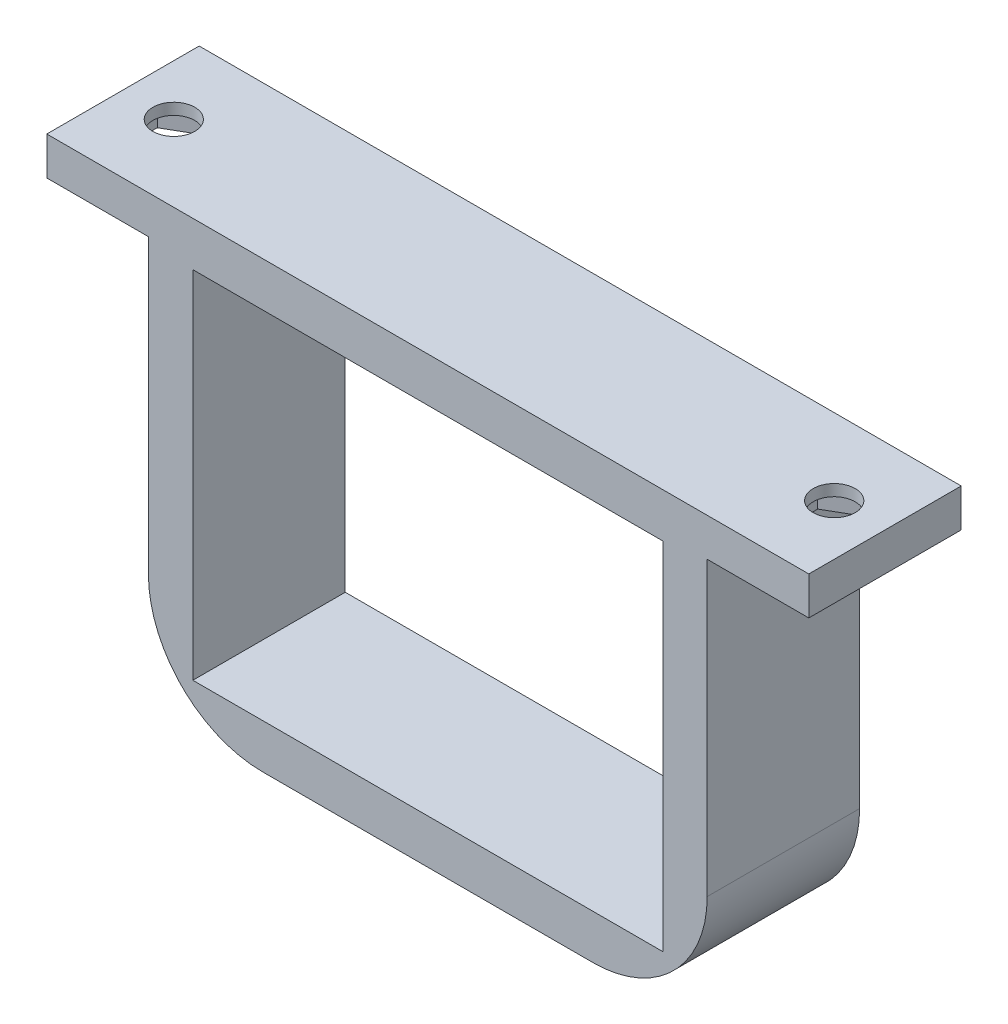
ISO-10303-21;
HEADER;
FILE_DESCRIPTION(('STEP AP214'),'2;1');
FILE_NAME('part.step','',(''),(''),'','','');
FILE_SCHEMA(('AUTOMOTIVE_DESIGN { 1 0 10303 214 1 1 1 1 }'));
ENDSEC;
DATA;
#1=APPLICATION_CONTEXT('core data for automotive mechanical design processes');
#2=APPLICATION_PROTOCOL_DEFINITION('international standard','automotive_design',2000,#1);
#3=PRODUCT_CONTEXT('',#1,'mechanical');
#4=PRODUCT('Part','Part','',(#3));
#5=PRODUCT_RELATED_PRODUCT_CATEGORY('part','',(#4));
#6=PRODUCT_DEFINITION_FORMATION('','',#4);
#7=PRODUCT_DEFINITION_CONTEXT('part definition',#1,'design');
#8=PRODUCT_DEFINITION('design','',#6,#7);
#9=PRODUCT_DEFINITION_SHAPE('','',#8);
#10=(LENGTH_UNIT() NAMED_UNIT(*) SI_UNIT(.MILLI.,.METRE.));
#11=(NAMED_UNIT(*) PLANE_ANGLE_UNIT() SI_UNIT($,.RADIAN.));
#12=(NAMED_UNIT(*) SI_UNIT($,.STERADIAN.) SOLID_ANGLE_UNIT());
#13=UNCERTAINTY_MEASURE_WITH_UNIT(LENGTH_MEASURE(1.E-05),#10,'distance_accuracy_value','');
#14=(GEOMETRIC_REPRESENTATION_CONTEXT(3) GLOBAL_UNCERTAINTY_ASSIGNED_CONTEXT((#13)) GLOBAL_UNIT_ASSIGNED_CONTEXT((#10,
#11,#12)) REPRESENTATION_CONTEXT('',''));
#15=CARTESIAN_POINT('',(0.,0.,0.));
#16=DIRECTION('',(0.,0.,1.));
#17=DIRECTION('',(1.,0.,0.));
#18=AXIS2_PLACEMENT_3D('',#15,#16,#17);
#19=CARTESIAN_POINT('',(0.,0.,7.8));
#20=DIRECTION('',(-1.,0.,0.));
#21=DIRECTION('',(0.,0.,1.));
#22=AXIS2_PLACEMENT_3D('',#19,#20,#21);
#23=PLANE('',#22);
#24=DIRECTION('',(0.,1.,0.));
#25=VECTOR('',#24,1.);
#26=CARTESIAN_POINT('',(0.,0.,10.));
#27=LINE('',#26,#25);
#28=CARTESIAN_POINT('',(0.,9.,10.));
#29=VERTEX_POINT('',#28);
#30=CARTESIAN_POINT('',(0.,32.,10.));
#31=VERTEX_POINT('',#30);
#32=EDGE_CURVE('E378',#29,#31,#27,.T.);
#33=ORIENTED_EDGE('',*,*,#32,.F.);
#34=DIRECTION('',(0.,0.,-1.));
#35=VECTOR('',#34,1.);
#36=CARTESIAN_POINT('',(0.,9.,-2.));
#37=LINE('',#36,#35);
#38=CARTESIAN_POINT('',(0.,9.,-2.));
#39=VERTEX_POINT('',#38);
#40=EDGE_CURVE('E461',#29,#39,#37,.T.);
#41=ORIENTED_EDGE('',*,*,#40,.T.);
#42=DIRECTION('',(0.,1.,0.));
#43=VECTOR('',#42,1.);
#44=CARTESIAN_POINT('',(0.,0.,-2.));
#45=LINE('',#44,#43);
#46=CARTESIAN_POINT('',(0.,32.,-2.));
#47=VERTEX_POINT('',#46);
#48=EDGE_CURVE('E424',#39,#47,#45,.T.);
#49=ORIENTED_EDGE('',*,*,#48,.T.);
#50=DIRECTION('',(0.,0.,-1.));
#51=VECTOR('',#50,1.);
#52=CARTESIAN_POINT('',(0.,32.,7.8));
#53=LINE('',#52,#51);
#54=EDGE_CURVE('E452',#31,#47,#53,.T.);
#55=ORIENTED_EDGE('',*,*,#54,.F.);
#56=EDGE_LOOP('',(#33,#41,#49,#55));
#57=FACE_BOUND('',#56,.T.);
#58=ADVANCED_FACE('F40',(#57),#23,.F.);
#59=CARTESIAN_POINT('',(0.,32.,7.8));
#60=DIRECTION('',(0.,-1.,0.));
#61=DIRECTION('',(0.,0.,-1.));
#62=AXIS2_PLACEMENT_3D('',#59,#60,#61);
#63=PLANE('',#62);
#64=DIRECTION('',(0.,0.,-1.));
#65=VECTOR('',#64,1.);
#66=CARTESIAN_POINT('',(0.925000000000016,32.,0.));
#67=LINE('',#66,#65);
#68=CARTESIAN_POINT('',(0.925000000000013,32.,5.7753520777581));
#69=VERTEX_POINT('',#68);
#70=CARTESIAN_POINT('',(0.925000000000015,32.,2.2246479222419));
#71=VERTEX_POINT('',#70);
#72=EDGE_CURVE('E58',#69,#71,#67,.T.);
#73=ORIENTED_EDGE('',*,*,#72,.F.);
#74=DIRECTION('',(-0.866025403784438,0.,-0.500000000000001));
#75=VECTOR('',#74,1.);
#76=CARTESIAN_POINT('',(-2.26955080756885,32.,3.93097730906827));
#77=LINE('',#76,#75);
#78=CARTESIAN_POINT('',(4.00000000000001,32.,7.5507041555162));
#79=VERTEX_POINT('',#78);
#80=EDGE_CURVE('E297',#79,#69,#77,.T.);
#81=ORIENTED_EDGE('',*,*,#80,.F.);
#82=DIRECTION('',(-0.866025403784439,0.,0.5));
#83=VECTOR('',#82,1.);
#84=CARTESIAN_POINT('',(4.2695508075689,32.,7.39507892420602));
#85=LINE('',#84,#83);
#86=CARTESIAN_POINT('',(7.07500000000001,32.,5.7753520777581));
#87=VERTEX_POINT('',#86);
#88=EDGE_CURVE('E333',#87,#79,#85,.T.);
#89=ORIENTED_EDGE('',*,*,#88,.F.);
#90=DIRECTION('',(0.,0.,1.));
#91=VECTOR('',#90,1.);
#92=CARTESIAN_POINT('',(7.07500000000002,32.,0.));
#93=LINE('',#92,#91);
#94=CARTESIAN_POINT('',(7.07500000000002,32.,2.2246479222419));
#95=VERTEX_POINT('',#94);
#96=EDGE_CURVE('E329',#95,#87,#93,.T.);
#97=ORIENTED_EDGE('',*,*,#96,.F.);
#98=DIRECTION('',(0.866025403784438,0.,0.500000000000001));
#99=VECTOR('',#98,1.);
#100=CARTESIAN_POINT('',(0.805449192431151,32.,-1.39507892420602));
#101=LINE('',#100,#99);
#102=CARTESIAN_POINT('',(4.00000000000002,32.,0.449295844483802));
#103=VERTEX_POINT('',#102);
#104=EDGE_CURVE('E325',#103,#95,#101,.T.);
#105=ORIENTED_EDGE('',*,*,#104,.F.);
#106=DIRECTION('',(0.866025403784439,0.,-0.499999999999999));
#107=VECTOR('',#106,1.);
#108=CARTESIAN_POINT('',(1.1945508075689,32.,2.06902269093172));
#109=LINE('',#108,#107);
#110=EDGE_CURVE('E320',#71,#103,#109,.T.);
#111=ORIENTED_EDGE('',*,*,#110,.F.);
#112=EDGE_LOOP('',(#73,#81,#89,#97,#105,#111));
#113=FACE_BOUND('',#112,.T.);
#114=ORIENTED_EDGE('',*,*,#54,.T.);
#115=DIRECTION('',(-1.,0.,0.));
#116=VECTOR('',#115,1.);
#117=CARTESIAN_POINT('',(0.,32.,-2.));
#118=LINE('',#117,#116);
#119=CARTESIAN_POINT('',(8.,32.,-2.));
#120=VERTEX_POINT('',#119);
#121=EDGE_CURVE('E427',#120,#47,#118,.T.);
#122=ORIENTED_EDGE('',*,*,#121,.F.);
#123=DIRECTION('',(0.,0.,-1.));
#124=VECTOR('',#123,1.);
#125=CARTESIAN_POINT('',(8.,32.,7.8));
#126=LINE('',#125,#124);
#127=CARTESIAN_POINT('',(8.,32.,10.));
#128=VERTEX_POINT('',#127);
#129=EDGE_CURVE('E474',#128,#120,#126,.T.);
#130=ORIENTED_EDGE('',*,*,#129,.F.);
#131=DIRECTION('',(-1.,0.,0.));
#132=VECTOR('',#131,1.);
#133=CARTESIAN_POINT('',(0.,32.,10.));
#134=LINE('',#133,#132);
#135=EDGE_CURVE('E381',#128,#31,#134,.T.);
#136=ORIENTED_EDGE('',*,*,#135,.T.);
#137=EDGE_LOOP('',(#114,#122,#130,#136));
#138=FACE_BOUND('',#137,.T.);
#139=ADVANCED_FACE('F530',(#113,#138),#63,.T.);
#140=CARTESIAN_POINT('',(8.,0.,7.8));
#141=DIRECTION('',(1.,0.,0.));
#142=DIRECTION('',(0.,0.,-1.));
#143=AXIS2_PLACEMENT_3D('',#140,#141,#142);
#144=PLANE('',#143);
#145=ORIENTED_EDGE('',*,*,#129,.T.);
#146=DIRECTION('',(0.,-1.,0.));
#147=VECTOR('',#146,1.);
#148=CARTESIAN_POINT('',(8.,0.,-2.));
#149=LINE('',#148,#147);
#150=CARTESIAN_POINT('',(8.,35.,-2.));
#151=VERTEX_POINT('',#150);
#152=EDGE_CURVE('E431',#151,#120,#149,.T.);
#153=ORIENTED_EDGE('',*,*,#152,.F.);
#154=DIRECTION('',(0.,0.,-1.));
#155=VECTOR('',#154,1.);
#156=CARTESIAN_POINT('',(8.,35.,7.8));
#157=LINE('',#156,#155);
#158=CARTESIAN_POINT('',(8.,35.,10.));
#159=VERTEX_POINT('',#158);
#160=EDGE_CURVE('E471',#159,#151,#157,.T.);
#161=ORIENTED_EDGE('',*,*,#160,.F.);
#162=DIRECTION('',(0.,-1.,0.));
#163=VECTOR('',#162,1.);
#164=CARTESIAN_POINT('',(8.,0.,10.));
#165=LINE('',#164,#163);
#166=EDGE_CURVE('E385',#159,#128,#165,.T.);
#167=ORIENTED_EDGE('',*,*,#166,.T.);
#168=EDGE_LOOP('',(#145,#153,#161,#167));
#169=FACE_BOUND('',#168,.T.);
#170=ADVANCED_FACE('F536',(#169),#144,.T.);
#171=CARTESIAN_POINT('',(0.,35.,7.8));
#172=DIRECTION('',(0.,-1.,0.));
#173=DIRECTION('',(0.,0.,-1.));
#174=AXIS2_PLACEMENT_3D('',#171,#172,#173);
#175=PLANE('',#174);
#176=CARTESIAN_POINT('',(-48.,35.,4.));
#177=DIRECTION('',(0.,-1.,0.));
#178=DIRECTION('',(0.,0.,-1.));
#179=AXIS2_PLACEMENT_3D('',#176,#177,#178);
#180=CIRCLE('',#179,1.65000000000001);
#181=CARTESIAN_POINT('',(-48.,35.,2.34999999999999));
#182=VERTEX_POINT('',#181);
#183=EDGE_CURVE('E511',#182,#182,#180,.T.);
#184=ORIENTED_EDGE('',*,*,#183,.T.);
#185=EDGE_LOOP('',(#184));
#186=FACE_BOUND('',#185,.T.);
#187=CARTESIAN_POINT('',(4.00000000000002,35.,4.));
#188=DIRECTION('',(0.,-1.,0.));
#189=DIRECTION('',(0.,0.,-1.));
#190=AXIS2_PLACEMENT_3D('',#187,#188,#189);
#191=CIRCLE('',#190,1.65000000000001);
#192=CARTESIAN_POINT('',(4.00000000000002,35.,2.34999999999999));
#193=VERTEX_POINT('',#192);
#194=EDGE_CURVE('E246',#193,#193,#191,.T.);
#195=ORIENTED_EDGE('',*,*,#194,.T.);
#196=EDGE_LOOP('',(#195));
#197=FACE_BOUND('',#196,.T.);
#198=ORIENTED_EDGE('',*,*,#160,.T.);
#199=DIRECTION('',(-1.,0.,0.));
#200=VECTOR('',#199,1.);
#201=CARTESIAN_POINT('',(0.,35.,-2.));
#202=LINE('',#201,#200);
#203=CARTESIAN_POINT('',(-52.,35.,-2.));
#204=VERTEX_POINT('',#203);
#205=EDGE_CURVE('E435',#151,#204,#202,.T.);
#206=ORIENTED_EDGE('',*,*,#205,.T.);
#207=DIRECTION('',(0.,0.,-1.));
#208=VECTOR('',#207,1.);
#209=CARTESIAN_POINT('',(-52.,35.,7.8));
#210=LINE('',#209,#208);
#211=CARTESIAN_POINT('',(-52.,35.,10.));
#212=VERTEX_POINT('',#211);
#213=EDGE_CURVE('E468',#212,#204,#210,.T.);
#214=ORIENTED_EDGE('',*,*,#213,.F.);
#215=DIRECTION('',(-1.,0.,0.));
#216=VECTOR('',#215,1.);
#217=CARTESIAN_POINT('',(0.,35.,10.));
#218=LINE('',#217,#216);
#219=EDGE_CURVE('E389',#159,#212,#218,.T.);
#220=ORIENTED_EDGE('',*,*,#219,.F.);
#221=EDGE_LOOP('',(#198,#206,#214,#220));
#222=FACE_BOUND('',#221,.T.);
#223=ADVANCED_FACE('F518',(#186,#197,#222),#175,.F.);
#224=CARTESIAN_POINT('',(-52.,0.,7.8));
#225=DIRECTION('',(1.,0.,0.));
#226=DIRECTION('',(0.,0.,-1.));
#227=AXIS2_PLACEMENT_3D('',#224,#225,#226);
#228=PLANE('',#227);
#229=ORIENTED_EDGE('',*,*,#213,.T.);
#230=DIRECTION('',(0.,-1.,0.));
#231=VECTOR('',#230,1.);
#232=CARTESIAN_POINT('',(-52.,0.,-2.));
#233=LINE('',#232,#231);
#234=CARTESIAN_POINT('',(-52.,32.,-2.));
#235=VERTEX_POINT('',#234);
#236=EDGE_CURVE('E439',#204,#235,#233,.T.);
#237=ORIENTED_EDGE('',*,*,#236,.T.);
#238=DIRECTION('',(0.,0.,-1.));
#239=VECTOR('',#238,1.);
#240=CARTESIAN_POINT('',(-52.,32.,7.8));
#241=LINE('',#240,#239);
#242=CARTESIAN_POINT('',(-52.,32.,10.));
#243=VERTEX_POINT('',#242);
#244=EDGE_CURVE('E465',#243,#235,#241,.T.);
#245=ORIENTED_EDGE('',*,*,#244,.F.);
#246=DIRECTION('',(0.,-1.,0.));
#247=VECTOR('',#246,1.);
#248=CARTESIAN_POINT('',(-52.,0.,10.));
#249=LINE('',#248,#247);
#250=EDGE_CURVE('E393',#212,#243,#249,.T.);
#251=ORIENTED_EDGE('',*,*,#250,.F.);
#252=EDGE_LOOP('',(#229,#237,#245,#251));
#253=FACE_BOUND('',#252,.T.);
#254=ADVANCED_FACE('F588',(#253),#228,.F.);
#255=CARTESIAN_POINT('',(0.,32.,7.8));
#256=DIRECTION('',(0.,1.,0.));
#257=DIRECTION('',(-1.,0.,0.));
#258=AXIS2_PLACEMENT_3D('',#255,#256,#257);
#259=PLANE('',#258);
#260=DIRECTION('',(0.,0.,1.));
#261=VECTOR('',#260,1.);
#262=CARTESIAN_POINT('',(-44.925,32.,0.));
#263=LINE('',#262,#261);
#264=CARTESIAN_POINT('',(-44.925,32.,2.22464792224189));
#265=VERTEX_POINT('',#264);
#266=CARTESIAN_POINT('',(-44.925,32.,5.77535207775809));
#267=VERTEX_POINT('',#266);
#268=EDGE_CURVE('E262',#265,#267,#263,.T.);
#269=ORIENTED_EDGE('',*,*,#268,.F.);
#270=DIRECTION('',(0.866025403784439,0.,0.5));
#271=VECTOR('',#270,1.);
#272=CARTESIAN_POINT('',(-12.1945508075688,32.,21.1215815741894));
#273=LINE('',#272,#271);
#274=CARTESIAN_POINT('',(-48.,32.,0.449295844483791));
#275=VERTEX_POINT('',#274);
#276=EDGE_CURVE('E66',#275,#265,#273,.T.);
#277=ORIENTED_EDGE('',*,*,#276,.F.);
#278=DIRECTION('',(0.866025403784439,0.,-0.5));
#279=VECTOR('',#278,1.);
#280=CARTESIAN_POINT('',(-11.8054491924311,32.,-20.4476378074637));
#281=LINE('',#280,#279);
#282=CARTESIAN_POINT('',(-51.075,32.,2.2246479222419));
#283=VERTEX_POINT('',#282);
#284=EDGE_CURVE('E239',#283,#275,#281,.T.);
#285=ORIENTED_EDGE('',*,*,#284,.F.);
#286=DIRECTION('',(0.,0.,-1.));
#287=VECTOR('',#286,1.);
#288=CARTESIAN_POINT('',(-51.075,32.,0.));
#289=LINE('',#288,#287);
#290=CARTESIAN_POINT('',(-51.075,32.,5.7753520777581));
#291=VERTEX_POINT('',#290);
#292=EDGE_CURVE('E243',#291,#283,#289,.T.);
#293=ORIENTED_EDGE('',*,*,#292,.F.);
#294=DIRECTION('',(-0.866025403784439,0.,-0.5));
#295=VECTOR('',#294,1.);
#296=CARTESIAN_POINT('',(-15.2695508075689,32.,26.4476378074637));
#297=LINE('',#296,#295);
#298=CARTESIAN_POINT('',(-48.,32.,7.5507041555162));
#299=VERTEX_POINT('',#298);
#300=EDGE_CURVE('E270',#299,#291,#297,.T.);
#301=ORIENTED_EDGE('',*,*,#300,.F.);
#302=DIRECTION('',(-0.866025403784439,0.,0.5));
#303=VECTOR('',#302,1.);
#304=CARTESIAN_POINT('',(-8.73044919243108,32.,-15.1215815741894));
#305=LINE('',#304,#303);
#306=EDGE_CURVE('E266',#267,#299,#305,.T.);
#307=ORIENTED_EDGE('',*,*,#306,.F.);
#308=EDGE_LOOP('',(#269,#277,#285,#293,#301,#307));
#309=FACE_BOUND('',#308,.T.);
#310=ORIENTED_EDGE('',*,*,#244,.T.);
#311=DIRECTION('',(1.,0.,0.));
#312=VECTOR('',#311,1.);
#313=CARTESIAN_POINT('',(0.,32.,-2.));
#314=LINE('',#313,#312);
#315=CARTESIAN_POINT('',(-44.,32.,-2.));
#316=VERTEX_POINT('',#315);
#317=EDGE_CURVE('E443',#235,#316,#314,.T.);
#318=ORIENTED_EDGE('',*,*,#317,.T.);
#319=DIRECTION('',(0.,0.,-1.));
#320=VECTOR('',#319,1.);
#321=CARTESIAN_POINT('',(-44.,32.,7.8));
#322=LINE('',#321,#320);
#323=CARTESIAN_POINT('',(-44.,32.,10.));
#324=VERTEX_POINT('',#323);
#325=EDGE_CURVE('E447',#324,#316,#322,.T.);
#326=ORIENTED_EDGE('',*,*,#325,.F.);
#327=DIRECTION('',(1.,0.,0.));
#328=VECTOR('',#327,1.);
#329=CARTESIAN_POINT('',(0.,32.,10.));
#330=LINE('',#329,#328);
#331=EDGE_CURVE('E397',#243,#324,#330,.T.);
#332=ORIENTED_EDGE('',*,*,#331,.F.);
#333=EDGE_LOOP('',(#310,#318,#326,#332));
#334=FACE_BOUND('',#333,.T.);
#335=ADVANCED_FACE('F573',(#309,#334),#259,.F.);
#336=CARTESIAN_POINT('',(-44.,0.,7.8));
#337=DIRECTION('',(-1.,0.,0.));
#338=DIRECTION('',(0.,0.,1.));
#339=AXIS2_PLACEMENT_3D('',#336,#337,#338);
#340=PLANE('',#339);
#341=DIRECTION('',(0.,1.,0.));
#342=VECTOR('',#341,1.);
#343=CARTESIAN_POINT('',(-44.,0.,-2.));
#344=LINE('',#343,#342);
#345=CARTESIAN_POINT('',(-44.,9.,-2.));
#346=VERTEX_POINT('',#345);
#347=EDGE_CURVE('E417',#346,#316,#344,.T.);
#348=ORIENTED_EDGE('',*,*,#347,.F.);
#349=DIRECTION('',(0.,0.,-1.));
#350=VECTOR('',#349,1.);
#351=CARTESIAN_POINT('',(-44.,9.,7.8));
#352=LINE('',#351,#350);
#353=CARTESIAN_POINT('',(-44.,9.,10.));
#354=VERTEX_POINT('',#353);
#355=EDGE_CURVE('E11',#346,#354,#352,.F.);
#356=ORIENTED_EDGE('',*,*,#355,.T.);
#357=DIRECTION('',(0.,1.,0.));
#358=VECTOR('',#357,1.);
#359=CARTESIAN_POINT('',(-44.,0.,10.));
#360=LINE('',#359,#358);
#361=EDGE_CURVE('E371',#354,#324,#360,.T.);
#362=ORIENTED_EDGE('',*,*,#361,.T.);
#363=ORIENTED_EDGE('',*,*,#325,.T.);
#364=EDGE_LOOP('',(#348,#356,#362,#363));
#365=FACE_BOUND('',#364,.T.);
#366=ADVANCED_FACE('F571',(#365),#340,.T.);
#367=CARTESIAN_POINT('',(0.,0.,7.8));
#368=DIRECTION('',(0.,-1.,0.));
#369=DIRECTION('',(1.,0.,0.));
#370=AXIS2_PLACEMENT_3D('',#367,#368,#369);
#371=PLANE('',#370);
#372=DIRECTION('',(-1.,0.,0.));
#373=VECTOR('',#372,1.);
#374=CARTESIAN_POINT('',(0.,0.,10.));
#375=LINE('',#374,#373);
#376=CARTESIAN_POINT('',(-9.,0.,10.));
#377=VERTEX_POINT('',#376);
#378=CARTESIAN_POINT('',(-35.,0.,10.));
#379=VERTEX_POINT('',#378);
#380=EDGE_CURVE('E374',#377,#379,#375,.T.);
#381=ORIENTED_EDGE('',*,*,#380,.T.);
#382=DIRECTION('',(0.,0.,-1.));
#383=VECTOR('',#382,1.);
#384=CARTESIAN_POINT('',(-35.,0.,7.8));
#385=LINE('',#384,#383);
#386=CARTESIAN_POINT('',(-35.,0.,-2.));
#387=VERTEX_POINT('',#386);
#388=EDGE_CURVE('E490',#379,#387,#385,.T.);
#389=ORIENTED_EDGE('',*,*,#388,.T.);
#390=DIRECTION('',(-1.,0.,0.));
#391=VECTOR('',#390,1.);
#392=CARTESIAN_POINT('',(0.,0.,-2.));
#393=LINE('',#392,#391);
#394=CARTESIAN_POINT('',(-9.,0.,-2.));
#395=VERTEX_POINT('',#394);
#396=EDGE_CURVE('E420',#395,#387,#393,.T.);
#397=ORIENTED_EDGE('',*,*,#396,.F.);
#398=DIRECTION('',(0.,0.,-1.));
#399=VECTOR('',#398,1.);
#400=CARTESIAN_POINT('',(-9.,0.,10.));
#401=LINE('',#400,#399);
#402=EDGE_CURVE('E493',#395,#377,#401,.F.);
#403=ORIENTED_EDGE('',*,*,#402,.T.);
#404=EDGE_LOOP('',(#381,#389,#397,#403));
#405=FACE_BOUND('',#404,.T.);
#406=ADVANCED_FACE('F562',(#405),#371,.T.);
#407=CARTESIAN_POINT('',(0.,0.,-2.));
#408=DIRECTION('',(0.,0.,1.));
#409=DIRECTION('',(1.,0.,0.));
#410=AXIS2_PLACEMENT_3D('',#407,#408,#409);
#411=PLANE('',#410);
#412=DIRECTION('',(0.,-1.,0.));
#413=VECTOR('',#412,1.);
#414=CARTESIAN_POINT('',(-40.5,0.,-2.));
#415=LINE('',#414,#413);
#416=CARTESIAN_POINT('',(-40.5,31.5,-2.));
#417=VERTEX_POINT('',#416);
#418=CARTESIAN_POINT('',(-40.5,3.5,-2.));
#419=VERTEX_POINT('',#418);
#420=EDGE_CURVE('E401',#417,#419,#415,.T.);
#421=ORIENTED_EDGE('',*,*,#420,.T.);
#422=DIRECTION('',(-1.,0.,0.));
#423=VECTOR('',#422,1.);
#424=CARTESIAN_POINT('',(0.,3.5,-2.));
#425=LINE('',#424,#423);
#426=CARTESIAN_POINT('',(-3.5,3.5,-2.));
#427=VERTEX_POINT('',#426);
#428=EDGE_CURVE('E413',#427,#419,#425,.T.);
#429=ORIENTED_EDGE('',*,*,#428,.F.);
#430=DIRECTION('',(0.,-1.,0.));
#431=VECTOR('',#430,1.);
#432=CARTESIAN_POINT('',(-3.5,0.,-2.));
#433=LINE('',#432,#431);
#434=CARTESIAN_POINT('',(-3.5,31.5,-2.));
#435=VERTEX_POINT('',#434);
#436=EDGE_CURVE('E409',#435,#427,#433,.T.);
#437=ORIENTED_EDGE('',*,*,#436,.F.);
#438=DIRECTION('',(-1.,0.,0.));
#439=VECTOR('',#438,1.);
#440=CARTESIAN_POINT('',(0.,31.5,-2.));
#441=LINE('',#440,#439);
#442=EDGE_CURVE('E405',#435,#417,#441,.T.);
#443=ORIENTED_EDGE('',*,*,#442,.T.);
#444=EDGE_LOOP('',(#421,#429,#437,#443));
#445=FACE_BOUND('',#444,.T.);
#446=ORIENTED_EDGE('',*,*,#48,.F.);
#447=CARTESIAN_POINT('',(-9.,9.,-2.));
#448=DIRECTION('',(0.,0.,1.));
#449=DIRECTION('',(1.,0.,0.));
#450=AXIS2_PLACEMENT_3D('',#447,#448,#449);
#451=CIRCLE('',#450,9.);
#452=EDGE_CURVE('E486',#39,#395,#451,.F.);
#453=ORIENTED_EDGE('',*,*,#452,.T.);
#454=ORIENTED_EDGE('',*,*,#396,.T.);
#455=CARTESIAN_POINT('',(-35.,9.,-2.));
#456=DIRECTION('',(0.,0.,1.));
#457=DIRECTION('',(1.,0.,0.));
#458=AXIS2_PLACEMENT_3D('',#455,#456,#457);
#459=CIRCLE('',#458,9.);
#460=EDGE_CURVE('E483',#387,#346,#459,.F.);
#461=ORIENTED_EDGE('',*,*,#460,.T.);
#462=ORIENTED_EDGE('',*,*,#347,.T.);
#463=ORIENTED_EDGE('',*,*,#317,.F.);
#464=ORIENTED_EDGE('',*,*,#236,.F.);
#465=ORIENTED_EDGE('',*,*,#205,.F.);
#466=ORIENTED_EDGE('',*,*,#152,.T.);
#467=ORIENTED_EDGE('',*,*,#121,.T.);
#468=EDGE_LOOP('',(#446,#453,#454,#461,#462,#463,#464,#465,#466,#467));
#469=FACE_BOUND('',#468,.T.);
#470=ADVANCED_FACE('F560',(#445,#469),#411,.F.);
#471=CARTESIAN_POINT('',(0.,31.5,7.8));
#472=DIRECTION('',(0.,-1.,0.));
#473=DIRECTION('',(0.,0.,-1.));
#474=AXIS2_PLACEMENT_3D('',#471,#472,#473);
#475=PLANE('',#474);
#476=DIRECTION('',(0.,0.,-1.));
#477=VECTOR('',#476,1.);
#478=CARTESIAN_POINT('',(-40.5,31.5,7.8));
#479=LINE('',#478,#477);
#480=CARTESIAN_POINT('',(-40.5,31.5,10.));
#481=VERTEX_POINT('',#480);
#482=EDGE_CURVE('E458',#481,#417,#479,.T.);
#483=ORIENTED_EDGE('',*,*,#482,.T.);
#484=ORIENTED_EDGE('',*,*,#442,.F.);
#485=DIRECTION('',(0.,0.,-1.));
#486=VECTOR('',#485,1.);
#487=CARTESIAN_POINT('',(-3.5,31.5,7.8));
#488=LINE('',#487,#486);
#489=CARTESIAN_POINT('',(-3.5,31.5,10.));
#490=VERTEX_POINT('',#489);
#491=EDGE_CURVE('E455',#490,#435,#488,.T.);
#492=ORIENTED_EDGE('',*,*,#491,.F.);
#493=DIRECTION('',(-1.,0.,0.));
#494=VECTOR('',#493,1.);
#495=CARTESIAN_POINT('',(0.,31.5,10.));
#496=LINE('',#495,#494);
#497=EDGE_CURVE('E359',#490,#481,#496,.T.);
#498=ORIENTED_EDGE('',*,*,#497,.T.);
#499=EDGE_LOOP('',(#483,#484,#492,#498));
#500=FACE_BOUND('',#499,.T.);
#501=ADVANCED_FACE('F666',(#500),#475,.T.);
#502=CARTESIAN_POINT('',(-3.5,0.,7.8));
#503=DIRECTION('',(1.,0.,0.));
#504=DIRECTION('',(0.,0.,-1.));
#505=AXIS2_PLACEMENT_3D('',#502,#503,#504);
#506=PLANE('',#505);
#507=ORIENTED_EDGE('',*,*,#491,.T.);
#508=ORIENTED_EDGE('',*,*,#436,.T.);
#509=DIRECTION('',(0.,0.,-1.));
#510=VECTOR('',#509,1.);
#511=CARTESIAN_POINT('',(-3.5,3.5,7.8));
#512=LINE('',#511,#510);
#513=CARTESIAN_POINT('',(-3.5,3.5,10.));
#514=VERTEX_POINT('',#513);
#515=EDGE_CURVE('E451',#514,#427,#512,.T.);
#516=ORIENTED_EDGE('',*,*,#515,.F.);
#517=DIRECTION('',(0.,-1.,0.));
#518=VECTOR('',#517,1.);
#519=CARTESIAN_POINT('',(-3.5,0.,10.));
#520=LINE('',#519,#518);
#521=EDGE_CURVE('E363',#490,#514,#520,.T.);
#522=ORIENTED_EDGE('',*,*,#521,.F.);
#523=EDGE_LOOP('',(#507,#508,#516,#522));
#524=FACE_BOUND('',#523,.T.);
#525=ADVANCED_FACE('F681',(#524),#506,.F.);
#526=CARTESIAN_POINT('',(0.,3.5,7.8));
#527=DIRECTION('',(0.,-1.,0.));
#528=DIRECTION('',(0.,0.,-1.));
#529=AXIS2_PLACEMENT_3D('',#526,#527,#528);
#530=PLANE('',#529);
#531=ORIENTED_EDGE('',*,*,#515,.T.);
#532=ORIENTED_EDGE('',*,*,#428,.T.);
#533=DIRECTION('',(0.,0.,-1.));
#534=VECTOR('',#533,1.);
#535=CARTESIAN_POINT('',(-40.5,3.5,7.8));
#536=LINE('',#535,#534);
#537=CARTESIAN_POINT('',(-40.5,3.5,10.));
#538=VERTEX_POINT('',#537);
#539=EDGE_CURVE('E448',#538,#419,#536,.T.);
#540=ORIENTED_EDGE('',*,*,#539,.F.);
#541=DIRECTION('',(-1.,0.,0.));
#542=VECTOR('',#541,1.);
#543=CARTESIAN_POINT('',(0.,3.5,10.));
#544=LINE('',#543,#542);
#545=EDGE_CURVE('E367',#514,#538,#544,.T.);
#546=ORIENTED_EDGE('',*,*,#545,.F.);
#547=EDGE_LOOP('',(#531,#532,#540,#546));
#548=FACE_BOUND('',#547,.T.);
#549=ADVANCED_FACE('F695',(#548),#530,.F.);
#550=CARTESIAN_POINT('',(-40.5,0.,7.8));
#551=DIRECTION('',(1.,0.,0.));
#552=DIRECTION('',(0.,0.,-1.));
#553=AXIS2_PLACEMENT_3D('',#550,#551,#552);
#554=PLANE('',#553);
#555=ORIENTED_EDGE('',*,*,#539,.T.);
#556=ORIENTED_EDGE('',*,*,#420,.F.);
#557=ORIENTED_EDGE('',*,*,#482,.F.);
#558=DIRECTION('',(0.,-1.,0.));
#559=VECTOR('',#558,1.);
#560=CARTESIAN_POINT('',(-40.5,0.,10.));
#561=LINE('',#560,#559);
#562=EDGE_CURVE('E280',#481,#538,#561,.T.);
#563=ORIENTED_EDGE('',*,*,#562,.T.);
#564=EDGE_LOOP('',(#555,#556,#557,#563));
#565=FACE_BOUND('',#564,.T.);
#566=ADVANCED_FACE('F550',(#565),#554,.T.);
#567=CARTESIAN_POINT('',(0.,0.,10.));
#568=DIRECTION('',(0.,0.,1.));
#569=DIRECTION('',(1.,0.,0.));
#570=AXIS2_PLACEMENT_3D('',#567,#568,#569);
#571=PLANE('',#570);
#572=ORIENTED_EDGE('',*,*,#562,.F.);
#573=ORIENTED_EDGE('',*,*,#497,.F.);
#574=ORIENTED_EDGE('',*,*,#521,.T.);
#575=ORIENTED_EDGE('',*,*,#545,.T.);
#576=EDGE_LOOP('',(#572,#573,#574,#575));
#577=FACE_BOUND('',#576,.T.);
#578=ORIENTED_EDGE('',*,*,#380,.F.);
#579=CARTESIAN_POINT('',(-9.,9.,10.));
#580=DIRECTION('',(0.,0.,1.));
#581=DIRECTION('',(1.,0.,0.));
#582=AXIS2_PLACEMENT_3D('',#579,#580,#581);
#583=CIRCLE('',#582,9.);
#584=EDGE_CURVE('E50',#377,#29,#583,.T.);
#585=ORIENTED_EDGE('',*,*,#584,.T.);
#586=ORIENTED_EDGE('',*,*,#32,.T.);
#587=ORIENTED_EDGE('',*,*,#135,.F.);
#588=ORIENTED_EDGE('',*,*,#166,.F.);
#589=ORIENTED_EDGE('',*,*,#219,.T.);
#590=ORIENTED_EDGE('',*,*,#250,.T.);
#591=ORIENTED_EDGE('',*,*,#331,.T.);
#592=ORIENTED_EDGE('',*,*,#361,.F.);
#593=CARTESIAN_POINT('',(-35.,9.,10.));
#594=DIRECTION('',(0.,0.,1.));
#595=DIRECTION('',(1.,0.,0.));
#596=AXIS2_PLACEMENT_3D('',#593,#594,#595);
#597=CIRCLE('',#596,9.);
#598=EDGE_CURVE('E496',#354,#379,#597,.T.);
#599=ORIENTED_EDGE('',*,*,#598,.T.);
#600=EDGE_LOOP('',(#578,#585,#586,#587,#588,#589,#590,#591,#592,#599));
#601=FACE_BOUND('',#600,.T.);
#602=ADVANCED_FACE('F543',(#577,#601),#571,.T.);
#603=CARTESIAN_POINT('',(-9.,9.,7.8));
#604=DIRECTION('',(0.,0.,1.));
#605=DIRECTION('',(1.,0.,0.));
#606=AXIS2_PLACEMENT_3D('',#603,#604,#605);
#607=CYLINDRICAL_SURFACE('',#606,9.);
#608=ORIENTED_EDGE('',*,*,#402,.F.);
#609=ORIENTED_EDGE('',*,*,#452,.F.);
#610=ORIENTED_EDGE('',*,*,#40,.F.);
#611=ORIENTED_EDGE('',*,*,#584,.F.);
#612=EDGE_LOOP('',(#608,#609,#610,#611));
#613=FACE_BOUND('',#612,.T.);
#614=ADVANCED_FACE('F541',(#613),#607,.T.);
#615=CARTESIAN_POINT('',(-35.,9.,7.8));
#616=DIRECTION('',(0.,0.,-1.));
#617=DIRECTION('',(-1.,0.,0.));
#618=AXIS2_PLACEMENT_3D('',#615,#616,#617);
#619=CYLINDRICAL_SURFACE('',#618,9.);
#620=ORIENTED_EDGE('',*,*,#388,.F.);
#621=ORIENTED_EDGE('',*,*,#598,.F.);
#622=ORIENTED_EDGE('',*,*,#355,.F.);
#623=ORIENTED_EDGE('',*,*,#460,.F.);
#624=EDGE_LOOP('',(#620,#621,#622,#623));
#625=FACE_BOUND('',#624,.T.);
#626=ADVANCED_FACE('F42',(#625),#619,.T.);
#627=CARTESIAN_POINT('',(-12.1945508075688,34.1,21.1215815741894));
#628=DIRECTION('',(0.5,0.,-0.866025403784439));
#629=DIRECTION('',(-0.866025403784439,0.,-0.5));
#630=AXIS2_PLACEMENT_3D('',#627,#628,#629);
#631=PLANE('',#630);
#632=ORIENTED_EDGE('',*,*,#276,.T.);
#633=DIRECTION('',(0.,-1.,0.));
#634=VECTOR('',#633,1.);
#635=CARTESIAN_POINT('',(-44.925,34.1,2.22464792224189));
#636=LINE('',#635,#634);
#637=CARTESIAN_POINT('',(-44.925,34.1,2.22464792224189));
#638=VERTEX_POINT('',#637);
#639=EDGE_CURVE('E213',#638,#265,#636,.T.);
#640=ORIENTED_EDGE('',*,*,#639,.F.);
#641=DIRECTION('',(0.866025403784439,0.,0.5));
#642=VECTOR('',#641,1.);
#643=CARTESIAN_POINT('',(-12.1945508075688,34.1,21.1215815741894));
#644=LINE('',#643,#642);
#645=CARTESIAN_POINT('',(-48.,34.1,0.449295844483791));
#646=VERTEX_POINT('',#645);
#647=EDGE_CURVE('E217',#646,#638,#644,.T.);
#648=ORIENTED_EDGE('',*,*,#647,.F.);
#649=DIRECTION('',(0.,-1.,0.));
#650=VECTOR('',#649,1.);
#651=CARTESIAN_POINT('',(-48.,34.1,0.449295844483791));
#652=LINE('',#651,#650);
#653=EDGE_CURVE('E277',#646,#275,#652,.T.);
#654=ORIENTED_EDGE('',*,*,#653,.T.);
#655=EDGE_LOOP('',(#632,#640,#648,#654));
#656=FACE_BOUND('',#655,.T.);
#657=ADVANCED_FACE('F215',(#656),#631,.F.);
#658=CARTESIAN_POINT('',(-11.8054491924311,34.1,-20.4476378074637));
#659=DIRECTION('',(-0.5,0.,-0.866025403784439));
#660=DIRECTION('',(-0.866025403784439,0.,0.5));
#661=AXIS2_PLACEMENT_3D('',#658,#659,#660);
#662=PLANE('',#661);
#663=ORIENTED_EDGE('',*,*,#284,.T.);
#664=ORIENTED_EDGE('',*,*,#653,.F.);
#665=DIRECTION('',(0.866025403784439,0.,-0.5));
#666=VECTOR('',#665,1.);
#667=CARTESIAN_POINT('',(-11.8054491924311,34.1,-20.4476378074637));
#668=LINE('',#667,#666);
#669=CARTESIAN_POINT('',(-51.075,34.1,2.2246479222419));
#670=VERTEX_POINT('',#669);
#671=EDGE_CURVE('E224',#670,#646,#668,.T.);
#672=ORIENTED_EDGE('',*,*,#671,.F.);
#673=DIRECTION('',(0.,-1.,0.));
#674=VECTOR('',#673,1.);
#675=CARTESIAN_POINT('',(-51.075,34.1,2.2246479222419));
#676=LINE('',#675,#674);
#677=EDGE_CURVE('E281',#670,#283,#676,.T.);
#678=ORIENTED_EDGE('',*,*,#677,.T.);
#679=EDGE_LOOP('',(#663,#664,#672,#678));
#680=FACE_BOUND('',#679,.T.);
#681=ADVANCED_FACE('F757',(#680),#662,.F.);
#682=CARTESIAN_POINT('',(-51.075,34.1,0.));
#683=DIRECTION('',(-1.,0.,0.));
#684=DIRECTION('',(0.,-1.,0.));
#685=AXIS2_PLACEMENT_3D('',#682,#683,#684);
#686=PLANE('',#685);
#687=ORIENTED_EDGE('',*,*,#292,.T.);
#688=ORIENTED_EDGE('',*,*,#677,.F.);
#689=DIRECTION('',(0.,0.,-1.));
#690=VECTOR('',#689,1.);
#691=CARTESIAN_POINT('',(-51.075,34.1,0.));
#692=LINE('',#691,#690);
#693=CARTESIAN_POINT('',(-51.075,34.1,5.7753520777581));
#694=VERTEX_POINT('',#693);
#695=EDGE_CURVE('E255',#694,#670,#692,.T.);
#696=ORIENTED_EDGE('',*,*,#695,.F.);
#697=DIRECTION('',(0.,-1.,0.));
#698=VECTOR('',#697,1.);
#699=CARTESIAN_POINT('',(-51.075,34.1,5.7753520777581));
#700=LINE('',#699,#698);
#701=EDGE_CURVE('E284',#694,#291,#700,.T.);
#702=ORIENTED_EDGE('',*,*,#701,.T.);
#703=EDGE_LOOP('',(#687,#688,#696,#702));
#704=FACE_BOUND('',#703,.T.);
#705=ADVANCED_FACE('F766',(#704),#686,.F.);
#706=CARTESIAN_POINT('',(-15.2695508075689,34.1,26.4476378074637));
#707=DIRECTION('',(-0.5,0.,0.866025403784439));
#708=DIRECTION('',(0.866025403784439,0.,0.5));
#709=AXIS2_PLACEMENT_3D('',#706,#707,#708);
#710=PLANE('',#709);
#711=ORIENTED_EDGE('',*,*,#300,.T.);
#712=ORIENTED_EDGE('',*,*,#701,.F.);
#713=DIRECTION('',(-0.866025403784439,0.,-0.5));
#714=VECTOR('',#713,1.);
#715=CARTESIAN_POINT('',(-15.2695508075689,34.1,26.4476378074637));
#716=LINE('',#715,#714);
#717=CARTESIAN_POINT('',(-48.,34.1,7.5507041555162));
#718=VERTEX_POINT('',#717);
#719=EDGE_CURVE('E251',#718,#694,#716,.T.);
#720=ORIENTED_EDGE('',*,*,#719,.F.);
#721=DIRECTION('',(0.,-1.,0.));
#722=VECTOR('',#721,1.);
#723=CARTESIAN_POINT('',(-48.,34.1,7.5507041555162));
#724=LINE('',#723,#722);
#725=EDGE_CURVE('E287',#718,#299,#724,.T.);
#726=ORIENTED_EDGE('',*,*,#725,.T.);
#727=EDGE_LOOP('',(#711,#712,#720,#726));
#728=FACE_BOUND('',#727,.T.);
#729=ADVANCED_FACE('F776',(#728),#710,.F.);
#730=CARTESIAN_POINT('',(-8.73044919243108,34.1,-15.1215815741894));
#731=DIRECTION('',(0.5,0.,0.866025403784439));
#732=DIRECTION('',(0.866025403784439,0.,-0.5));
#733=AXIS2_PLACEMENT_3D('',#730,#731,#732);
#734=PLANE('',#733);
#735=ORIENTED_EDGE('',*,*,#306,.T.);
#736=ORIENTED_EDGE('',*,*,#725,.F.);
#737=DIRECTION('',(-0.866025403784439,0.,0.5));
#738=VECTOR('',#737,1.);
#739=CARTESIAN_POINT('',(-8.73044919243108,34.1,-15.1215815741894));
#740=LINE('',#739,#738);
#741=CARTESIAN_POINT('',(-44.925,34.1,5.77535207775809));
#742=VERTEX_POINT('',#741);
#743=EDGE_CURVE('E233',#742,#718,#740,.T.);
#744=ORIENTED_EDGE('',*,*,#743,.F.);
#745=DIRECTION('',(0.,-1.,0.));
#746=VECTOR('',#745,1.);
#747=CARTESIAN_POINT('',(-44.925,34.1,5.77535207775809));
#748=LINE('',#747,#746);
#749=EDGE_CURVE('E223',#742,#267,#748,.T.);
#750=ORIENTED_EDGE('',*,*,#749,.T.);
#751=EDGE_LOOP('',(#735,#736,#744,#750));
#752=FACE_BOUND('',#751,.T.);
#753=ADVANCED_FACE('F786',(#752),#734,.F.);
#754=CARTESIAN_POINT('',(-44.925,34.1,0.));
#755=DIRECTION('',(1.,0.,0.));
#756=DIRECTION('',(0.,1.,0.));
#757=AXIS2_PLACEMENT_3D('',#754,#755,#756);
#758=PLANE('',#757);
#759=ORIENTED_EDGE('',*,*,#268,.T.);
#760=ORIENTED_EDGE('',*,*,#749,.F.);
#761=DIRECTION('',(0.,0.,1.));
#762=VECTOR('',#761,1.);
#763=CARTESIAN_POINT('',(-44.925,34.1,0.));
#764=LINE('',#763,#762);
#765=EDGE_CURVE('E227',#638,#742,#764,.T.);
#766=ORIENTED_EDGE('',*,*,#765,.F.);
#767=ORIENTED_EDGE('',*,*,#639,.T.);
#768=EDGE_LOOP('',(#759,#760,#766,#767));
#769=FACE_BOUND('',#768,.T.);
#770=ADVANCED_FACE('F228',(#769),#758,.F.);
#771=CARTESIAN_POINT('',(0.,34.1,0.));
#772=DIRECTION('',(0.,-1.,0.));
#773=DIRECTION('',(1.,0.,0.));
#774=AXIS2_PLACEMENT_3D('',#771,#772,#773);
#775=PLANE('',#774);
#776=CARTESIAN_POINT('',(-48.,34.1,4.));
#777=DIRECTION('',(0.,-1.,0.));
#778=DIRECTION('',(1.,0.,0.));
#779=AXIS2_PLACEMENT_3D('',#776,#777,#778);
#780=CIRCLE('',#779,1.65000000000001);
#781=CARTESIAN_POINT('',(-46.35,34.1,4.));
#782=VERTEX_POINT('',#781);
#783=EDGE_CURVE('E44',#782,#782,#780,.T.);
#784=ORIENTED_EDGE('',*,*,#783,.F.);
#785=EDGE_LOOP('',(#784));
#786=FACE_BOUND('',#785,.T.);
#787=ORIENTED_EDGE('',*,*,#647,.T.);
#788=ORIENTED_EDGE('',*,*,#765,.T.);
#789=ORIENTED_EDGE('',*,*,#743,.T.);
#790=ORIENTED_EDGE('',*,*,#719,.T.);
#791=ORIENTED_EDGE('',*,*,#695,.T.);
#792=ORIENTED_EDGE('',*,*,#671,.T.);
#793=EDGE_LOOP('',(#787,#788,#789,#790,#791,#792));
#794=FACE_BOUND('',#793,.T.);
#795=ADVANCED_FACE('F235',(#786,#794),#775,.T.);
#796=CARTESIAN_POINT('',(0.925000000000017,34.1,0.));
#797=DIRECTION('',(-1.,0.,0.));
#798=DIRECTION('',(0.,-1.,0.));
#799=AXIS2_PLACEMENT_3D('',#796,#797,#798);
#800=PLANE('',#799);
#801=ORIENTED_EDGE('',*,*,#72,.T.);
#802=DIRECTION('',(0.,-1.,0.));
#803=VECTOR('',#802,1.);
#804=CARTESIAN_POINT('',(0.925000000000017,34.1,2.2246479222419));
#805=LINE('',#804,#803);
#806=CARTESIAN_POINT('',(0.925000000000017,34.1,2.2246479222419));
#807=VERTEX_POINT('',#806);
#808=EDGE_CURVE('E317',#807,#71,#805,.T.);
#809=ORIENTED_EDGE('',*,*,#808,.F.);
#810=DIRECTION('',(0.,0.,-1.));
#811=VECTOR('',#810,1.);
#812=CARTESIAN_POINT('',(0.925000000000017,34.1,0.));
#813=LINE('',#812,#811);
#814=CARTESIAN_POINT('',(0.925000000000015,34.1,5.7753520777581));
#815=VERTEX_POINT('',#814);
#816=EDGE_CURVE('E292',#815,#807,#813,.T.);
#817=ORIENTED_EDGE('',*,*,#816,.F.);
#818=DIRECTION('',(0.,-1.,0.));
#819=VECTOR('',#818,1.);
#820=CARTESIAN_POINT('',(0.925000000000015,34.1,5.7753520777581));
#821=LINE('',#820,#819);
#822=EDGE_CURVE('E263',#815,#69,#821,.T.);
#823=ORIENTED_EDGE('',*,*,#822,.T.);
#824=EDGE_LOOP('',(#801,#809,#817,#823));
#825=FACE_BOUND('',#824,.T.);
#826=ADVANCED_FACE('F813',(#825),#800,.F.);
#827=CARTESIAN_POINT('',(-2.26955080756885,34.1,3.93097730906827));
#828=DIRECTION('',(-0.500000000000001,0.,0.866025403784438));
#829=DIRECTION('',(0.866025403784438,0.,0.500000000000001));
#830=AXIS2_PLACEMENT_3D('',#827,#828,#829);
#831=PLANE('',#830);
#832=ORIENTED_EDGE('',*,*,#80,.T.);
#833=ORIENTED_EDGE('',*,*,#822,.F.);
#834=DIRECTION('',(-0.866025403784438,0.,-0.500000000000001));
#835=VECTOR('',#834,1.);
#836=CARTESIAN_POINT('',(-2.26955080756885,34.1,3.93097730906827));
#837=LINE('',#836,#835);
#838=CARTESIAN_POINT('',(4.00000000000001,34.1,7.5507041555162));
#839=VERTEX_POINT('',#838);
#840=EDGE_CURVE('E313',#839,#815,#837,.T.);
#841=ORIENTED_EDGE('',*,*,#840,.F.);
#842=DIRECTION('',(0.,-1.,0.));
#843=VECTOR('',#842,1.);
#844=CARTESIAN_POINT('',(4.00000000000001,34.1,7.5507041555162));
#845=LINE('',#844,#843);
#846=EDGE_CURVE('E342',#839,#79,#845,.T.);
#847=ORIENTED_EDGE('',*,*,#846,.T.);
#848=EDGE_LOOP('',(#832,#833,#841,#847));
#849=FACE_BOUND('',#848,.T.);
#850=ADVANCED_FACE('F823',(#849),#831,.F.);
#851=CARTESIAN_POINT('',(4.2695508075689,34.1,7.39507892420602));
#852=DIRECTION('',(0.5,0.,0.866025403784439));
#853=DIRECTION('',(0.866025403784439,0.,-0.5));
#854=AXIS2_PLACEMENT_3D('',#851,#852,#853);
#855=PLANE('',#854);
#856=ORIENTED_EDGE('',*,*,#88,.T.);
#857=ORIENTED_EDGE('',*,*,#846,.F.);
#858=DIRECTION('',(-0.866025403784439,0.,0.5));
#859=VECTOR('',#858,1.);
#860=CARTESIAN_POINT('',(4.2695508075689,34.1,7.39507892420602));
#861=LINE('',#860,#859);
#862=CARTESIAN_POINT('',(7.07500000000002,34.1,5.7753520777581));
#863=VERTEX_POINT('',#862);
#864=EDGE_CURVE('E309',#863,#839,#861,.T.);
#865=ORIENTED_EDGE('',*,*,#864,.F.);
#866=DIRECTION('',(0.,-1.,0.));
#867=VECTOR('',#866,1.);
#868=CARTESIAN_POINT('',(7.07500000000002,34.1,5.7753520777581));
#869=LINE('',#868,#867);
#870=EDGE_CURVE('E345',#863,#87,#869,.T.);
#871=ORIENTED_EDGE('',*,*,#870,.T.);
#872=EDGE_LOOP('',(#856,#857,#865,#871));
#873=FACE_BOUND('',#872,.T.);
#874=ADVANCED_FACE('F832',(#873),#855,.F.);
#875=CARTESIAN_POINT('',(7.07500000000002,34.1,0.));
#876=DIRECTION('',(1.,0.,0.));
#877=DIRECTION('',(0.,1.,0.));
#878=AXIS2_PLACEMENT_3D('',#875,#876,#877);
#879=PLANE('',#878);
#880=ORIENTED_EDGE('',*,*,#96,.T.);
#881=ORIENTED_EDGE('',*,*,#870,.F.);
#882=DIRECTION('',(0.,0.,1.));
#883=VECTOR('',#882,1.);
#884=CARTESIAN_POINT('',(7.07500000000002,34.1,0.));
#885=LINE('',#884,#883);
#886=CARTESIAN_POINT('',(7.07500000000002,34.1,2.2246479222419));
#887=VERTEX_POINT('',#886);
#888=EDGE_CURVE('E305',#887,#863,#885,.T.);
#889=ORIENTED_EDGE('',*,*,#888,.F.);
#890=DIRECTION('',(0.,-1.,0.));
#891=VECTOR('',#890,1.);
#892=CARTESIAN_POINT('',(7.07500000000002,34.1,2.2246479222419));
#893=LINE('',#892,#891);
#894=EDGE_CURVE('E348',#887,#95,#893,.T.);
#895=ORIENTED_EDGE('',*,*,#894,.T.);
#896=EDGE_LOOP('',(#880,#881,#889,#895));
#897=FACE_BOUND('',#896,.T.);
#898=ADVANCED_FACE('F842',(#897),#879,.F.);
#899=CARTESIAN_POINT('',(0.805449192431153,34.1,-1.39507892420602));
#900=DIRECTION('',(0.500000000000001,0.,-0.866025403784438));
#901=DIRECTION('',(-0.866025403784438,0.,-0.500000000000001));
#902=AXIS2_PLACEMENT_3D('',#899,#900,#901);
#903=PLANE('',#902);
#904=ORIENTED_EDGE('',*,*,#104,.T.);
#905=ORIENTED_EDGE('',*,*,#894,.F.);
#906=DIRECTION('',(0.866025403784438,0.,0.500000000000001));
#907=VECTOR('',#906,1.);
#908=CARTESIAN_POINT('',(0.805449192431153,34.1,-1.39507892420602));
#909=LINE('',#908,#907);
#910=CARTESIAN_POINT('',(4.00000000000002,34.1,0.449295844483802));
#911=VERTEX_POINT('',#910);
#912=EDGE_CURVE('E301',#911,#887,#909,.T.);
#913=ORIENTED_EDGE('',*,*,#912,.F.);
#914=DIRECTION('',(0.,-1.,0.));
#915=VECTOR('',#914,1.);
#916=CARTESIAN_POINT('',(4.00000000000002,34.1,0.449295844483802));
#917=LINE('',#916,#915);
#918=EDGE_CURVE('E351',#911,#103,#917,.T.);
#919=ORIENTED_EDGE('',*,*,#918,.T.);
#920=EDGE_LOOP('',(#904,#905,#913,#919));
#921=FACE_BOUND('',#920,.T.);
#922=ADVANCED_FACE('F852',(#921),#903,.F.);
#923=CARTESIAN_POINT('',(1.1945508075689,34.1,2.06902269093172));
#924=DIRECTION('',(-0.499999999999999,0.,-0.866025403784439));
#925=DIRECTION('',(-0.866025403784439,0.,0.499999999999999));
#926=AXIS2_PLACEMENT_3D('',#923,#924,#925);
#927=PLANE('',#926);
#928=ORIENTED_EDGE('',*,*,#110,.T.);
#929=ORIENTED_EDGE('',*,*,#918,.F.);
#930=DIRECTION('',(0.866025403784439,0.,-0.499999999999999));
#931=VECTOR('',#930,1.);
#932=CARTESIAN_POINT('',(1.1945508075689,34.1,2.06902269093172));
#933=LINE('',#932,#931);
#934=EDGE_CURVE('E296',#807,#911,#933,.T.);
#935=ORIENTED_EDGE('',*,*,#934,.F.);
#936=ORIENTED_EDGE('',*,*,#808,.T.);
#937=EDGE_LOOP('',(#928,#929,#935,#936));
#938=FACE_BOUND('',#937,.T.);
#939=ADVANCED_FACE('F862',(#938),#927,.F.);
#940=CARTESIAN_POINT('',(0.,34.1,0.));
#941=DIRECTION('',(0.,-1.,0.));
#942=DIRECTION('',(1.,0.,0.));
#943=AXIS2_PLACEMENT_3D('',#940,#941,#942);
#944=PLANE('',#943);
#945=CARTESIAN_POINT('',(4.00000000000002,34.1,4.));
#946=DIRECTION('',(0.,-1.,0.));
#947=DIRECTION('',(1.,0.,0.));
#948=AXIS2_PLACEMENT_3D('',#945,#946,#947);
#949=CIRCLE('',#948,1.65000000000001);
#950=CARTESIAN_POINT('',(5.65000000000003,34.1,4.));
#951=VERTEX_POINT('',#950);
#952=EDGE_CURVE('E321',#951,#951,#949,.T.);
#953=ORIENTED_EDGE('',*,*,#952,.F.);
#954=EDGE_LOOP('',(#953));
#955=FACE_BOUND('',#954,.T.);
#956=ORIENTED_EDGE('',*,*,#816,.T.);
#957=ORIENTED_EDGE('',*,*,#934,.T.);
#958=ORIENTED_EDGE('',*,*,#912,.T.);
#959=ORIENTED_EDGE('',*,*,#888,.T.);
#960=ORIENTED_EDGE('',*,*,#864,.T.);
#961=ORIENTED_EDGE('',*,*,#840,.T.);
#962=EDGE_LOOP('',(#956,#957,#958,#959,#960,#961));
#963=FACE_BOUND('',#962,.T.);
#964=ADVANCED_FACE('F527',(#955,#963),#944,.T.);
#965=CARTESIAN_POINT('',(4.00000000000002,32.,4.));
#966=DIRECTION('',(0.,-1.,0.));
#967=DIRECTION('',(0.,0.,-1.));
#968=AXIS2_PLACEMENT_3D('',#965,#966,#967);
#969=CYLINDRICAL_SURFACE('',#968,1.65000000000001);
#970=ORIENTED_EDGE('',*,*,#952,.T.);
#971=EDGE_LOOP('',(#970));
#972=FACE_BOUND('',#971,.T.);
#973=ORIENTED_EDGE('',*,*,#194,.F.);
#974=EDGE_LOOP('',(#973));
#975=FACE_BOUND('',#974,.T.);
#976=ADVANCED_FACE('F522',(#972,#975),#969,.F.);
#977=CARTESIAN_POINT('',(-48.,32.,4.));
#978=DIRECTION('',(0.,-1.,0.));
#979=DIRECTION('',(0.,0.,-1.));
#980=AXIS2_PLACEMENT_3D('',#977,#978,#979);
#981=CYLINDRICAL_SURFACE('',#980,1.65000000000001);
#982=ORIENTED_EDGE('',*,*,#783,.T.);
#983=EDGE_LOOP('',(#982));
#984=FACE_BOUND('',#983,.T.);
#985=ORIENTED_EDGE('',*,*,#183,.F.);
#986=EDGE_LOOP('',(#985));
#987=FACE_BOUND('',#986,.T.);
#988=ADVANCED_FACE('F520',(#984,#987),#981,.F.);
#989=CLOSED_SHELL('',(#58,#139,#170,#223,#254,#335,#366,#406,#470,#501,#525,#549,#566,#602,#614,
#626,#657,#681,#705,#729,#753,#770,#795,#826,#850,#874,#898,#922,#939,#964,#976,#988));
#990=MANIFOLD_SOLID_BREP('B2',#989);
#991=ADVANCED_BREP_SHAPE_REPRESENTATION('',(#18,#990),#14);
#992=SHAPE_DEFINITION_REPRESENTATION(#9,#991);
ENDSEC;
END-ISO-10303-21;
